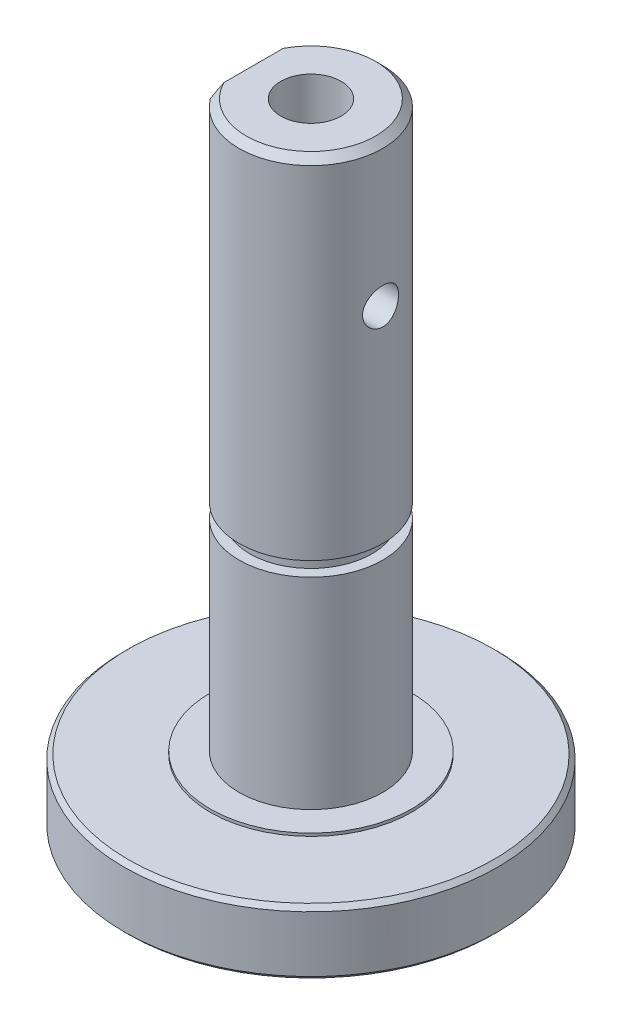
ISO-10303-21;
HEADER;
FILE_DESCRIPTION(('STEP AP214'),'2;1');
FILE_NAME('part.step','',(''),(''),'','','');
FILE_SCHEMA(('AUTOMOTIVE_DESIGN { 1 0 10303 214 1 1 1 1 }'));
ENDSEC;
DATA;
#1=APPLICATION_CONTEXT('core data for automotive mechanical design processes');
#2=APPLICATION_PROTOCOL_DEFINITION('international standard','automotive_design',2000,#1);
#3=PRODUCT_CONTEXT('',#1,'mechanical');
#4=PRODUCT('Part','Part','',(#3));
#5=PRODUCT_RELATED_PRODUCT_CATEGORY('part','',(#4));
#6=PRODUCT_DEFINITION_FORMATION('','',#4);
#7=PRODUCT_DEFINITION_CONTEXT('part definition',#1,'design');
#8=PRODUCT_DEFINITION('design','',#6,#7);
#9=PRODUCT_DEFINITION_SHAPE('','',#8);
#10=(LENGTH_UNIT() NAMED_UNIT(*) SI_UNIT(.MILLI.,.METRE.));
#11=(NAMED_UNIT(*) PLANE_ANGLE_UNIT() SI_UNIT($,.RADIAN.));
#12=(NAMED_UNIT(*) SI_UNIT($,.STERADIAN.) SOLID_ANGLE_UNIT());
#13=UNCERTAINTY_MEASURE_WITH_UNIT(LENGTH_MEASURE(1.E-05),#10,'distance_accuracy_value','');
#14=(GEOMETRIC_REPRESENTATION_CONTEXT(3) GLOBAL_UNCERTAINTY_ASSIGNED_CONTEXT((#13)) GLOBAL_UNIT_ASSIGNED_CONTEXT((#10,
#11,#12)) REPRESENTATION_CONTEXT('',''));
#15=CARTESIAN_POINT('',(0.,0.,0.));
#16=DIRECTION('',(0.,0.,1.));
#17=DIRECTION('',(1.,0.,0.));
#18=AXIS2_PLACEMENT_3D('',#15,#16,#17);
#19=CARTESIAN_POINT('',(0.,0.,0.));
#20=DIRECTION('',(0.,1.,0.));
#21=DIRECTION('',(0.,0.,1.));
#22=AXIS2_PLACEMENT_3D('',#19,#20,#21);
#23=CYLINDRICAL_SURFACE('',#22,13.);
#24=CARTESIAN_POINT('',(0.,4.19999999999998,0.));
#25=DIRECTION('',(0.,1.,0.));
#26=DIRECTION('',(0.,0.,1.));
#27=AXIS2_PLACEMENT_3D('',#24,#25,#26);
#28=CIRCLE('',#27,13.);
#29=CARTESIAN_POINT('',(0.,4.19999999999998,13.));
#30=VERTEX_POINT('',#29);
#31=EDGE_CURVE('E186',#30,#30,#28,.F.);
#32=ORIENTED_EDGE('',*,*,#31,.T.);
#33=EDGE_LOOP('',(#32));
#34=FACE_BOUND('',#33,.T.);
#35=CARTESIAN_POINT('',(0.,0.300000000000004,0.));
#36=DIRECTION('',(0.,-1.,0.));
#37=DIRECTION('',(0.,0.,-1.));
#38=AXIS2_PLACEMENT_3D('',#35,#36,#37);
#39=CIRCLE('',#38,13.);
#40=CARTESIAN_POINT('',(0.,0.300000000000004,-13.));
#41=VERTEX_POINT('',#40);
#42=EDGE_CURVE('E184',#41,#41,#39,.F.);
#43=ORIENTED_EDGE('',*,*,#42,.T.);
#44=EDGE_LOOP('',(#43));
#45=FACE_BOUND('',#44,.T.);
#46=ADVANCED_FACE('F36',(#34,#45),#23,.T.);
#47=CARTESIAN_POINT('',(13.,0.,0.));
#48=DIRECTION('',(0.,-1.,0.));
#49=DIRECTION('',(0.,0.,-1.));
#50=AXIS2_PLACEMENT_3D('',#47,#48,#49);
#51=PLANE('',#50);
#52=CARTESIAN_POINT('',(0.,0.,0.));
#53=DIRECTION('',(0.,-1.,0.));
#54=DIRECTION('',(0.,0.,-1.));
#55=AXIS2_PLACEMENT_3D('',#52,#53,#54);
#56=CIRCLE('',#55,12.7);
#57=CARTESIAN_POINT('',(0.,0.,-12.7));
#58=VERTEX_POINT('',#57);
#59=EDGE_CURVE('E181',#58,#58,#56,.T.);
#60=ORIENTED_EDGE('',*,*,#59,.T.);
#61=EDGE_LOOP('',(#60));
#62=FACE_BOUND('',#61,.T.);
#63=ADVANCED_FACE('F161',(#62),#51,.T.);
#64=CARTESIAN_POINT('',(0.,44.,0.));
#65=DIRECTION('',(0.,1.,0.));
#66=DIRECTION('',(0.,0.,1.));
#67=AXIS2_PLACEMENT_3D('',#64,#65,#66);
#68=PLANE('',#67);
#69=CARTESIAN_POINT('',(0.,44.,0.));
#70=DIRECTION('',(0.,1.,0.));
#71=DIRECTION('',(0.,0.,1.));
#72=AXIS2_PLACEMENT_3D('',#69,#70,#71);
#73=CIRCLE('',#72,2.09999999999999);
#74=CARTESIAN_POINT('',(0.,44.,2.09999999999998));
#75=VERTEX_POINT('',#74);
#76=EDGE_CURVE('E83',#75,#75,#73,.T.);
#77=ORIENTED_EDGE('',*,*,#76,.F.);
#78=EDGE_LOOP('',(#77));
#79=FACE_BOUND('',#78,.T.);
#80=DIRECTION('',(0.,0.,-1.));
#81=VECTOR('',#80,1.);
#82=CARTESIAN_POINT('',(-4.,44.,3.));
#83=LINE('',#82,#81);
#84=CARTESIAN_POINT('',(-4.,44.,2.06155281280882));
#85=VERTEX_POINT('',#84);
#86=CARTESIAN_POINT('',(-4.,44.,-2.06155281280882));
#87=VERTEX_POINT('',#86);
#88=EDGE_CURVE('E82',#85,#87,#83,.T.);
#89=ORIENTED_EDGE('',*,*,#88,.F.);
#90=CARTESIAN_POINT('',(0.,44.,0.));
#91=DIRECTION('',(0.,1.,0.));
#92=DIRECTION('',(0.,0.,1.));
#93=AXIS2_PLACEMENT_3D('',#90,#91,#92);
#94=CIRCLE('',#93,4.5);
#95=EDGE_CURVE('E193',#85,#87,#94,.T.);
#96=ORIENTED_EDGE('',*,*,#95,.T.);
#97=EDGE_LOOP('',(#89,#96));
#98=FACE_BOUND('',#97,.T.);
#99=ADVANCED_FACE('F156',(#79,#98),#68,.T.);
#100=CARTESIAN_POINT('',(0.,0.,0.));
#101=DIRECTION('',(0.,1.,0.));
#102=DIRECTION('',(0.,0.,1.));
#103=AXIS2_PLACEMENT_3D('',#100,#101,#102);
#104=CYLINDRICAL_SURFACE('',#103,5.);
#105=CARTESIAN_POINT('',(4.84122918275928,34.,1.24999999999997));
#106=CARTESIAN_POINT('',(4.84123050042655,33.9309746245377,1.24999803929586));
#107=CARTESIAN_POINT('',(4.84272153006957,33.861927550661,1.24426312274862));
#108=CARTESIAN_POINT('',(4.84850930996625,33.725816210913,1.22151156273204));
#109=CARTESIAN_POINT('',(4.85280769310907,33.6587531227658,1.20448835337107));
#110=CARTESIAN_POINT('',(4.86369362297984,33.5285982309065,1.15974559981594));
#111=CARTESIAN_POINT('',(4.87027821345205,33.4655014223072,1.1320398639272));
#112=CARTESIAN_POINT('',(4.88499096014404,33.3448445737301,1.06676057063068));
#113=CARTESIAN_POINT('',(4.89311918189252,33.2872847689599,1.02918659428032));
#114=CARTESIAN_POINT('',(4.91020358177806,33.1780691773689,0.944354213655909));
#115=CARTESIAN_POINT('',(4.91917298811516,33.126553199825,0.896918443851998));
#116=CARTESIAN_POINT('',(4.93681437757649,33.0321193028199,0.794091032050308));
#117=CARTESIAN_POINT('',(4.94548633283195,32.9892021871892,0.73869864709013));
#118=CARTESIAN_POINT('',(4.96170207760291,32.9126122661844,0.620572600539457));
#119=CARTESIAN_POINT('',(4.96922843700296,32.8790768059193,0.557747288097542));
#120=CARTESIAN_POINT('',(4.98215405962992,32.8230951779235,0.427131592146366));
#121=CARTESIAN_POINT('',(4.98755363667172,32.8006473740423,0.359341942895956));
#122=CARTESIAN_POINT('',(4.9955237942409,32.7679260827107,0.222179379377068));
#123=CARTESIAN_POINT('',(4.99814946922157,32.7574151778367,0.152866359774477));
#124=CARTESIAN_POINT('',(5.00046797053649,32.7481208103622,0.0134144096313771));
#125=CARTESIAN_POINT('',(5.00016123048352,32.7493356138952,-0.056724397269041));
#126=CARTESIAN_POINT('',(4.99669047476767,32.7632874251251,-0.194190308965488));
#127=CARTESIAN_POINT('',(4.99359001170437,32.775768162527,-0.261545269501336));
#128=CARTESIAN_POINT('',(4.98495418262427,32.8114856350243,-0.393172809267107));
#129=CARTESIAN_POINT('',(4.9794186869922,32.8347229426887,-0.457445224213046));
#130=CARTESIAN_POINT('',(4.96643754850448,32.8915012853436,-0.581758379377254));
#131=CARTESIAN_POINT('',(4.95897509847527,32.9251335223309,-0.641755637208126));
#132=CARTESIAN_POINT('',(4.94294951904825,33.0016778395582,-0.755344527925603));
#133=CARTESIAN_POINT('',(4.93438619826245,33.0445915342803,-0.808935043856872));
#134=CARTESIAN_POINT('',(4.9168185688476,33.1398543709912,-0.909717543856183));
#135=CARTESIAN_POINT('',(4.90780859762959,33.1924274461739,-0.956697098843987));
#136=CARTESIAN_POINT('',(4.89057521758353,33.3047999867701,-1.04122046995376));
#137=CARTESIAN_POINT('',(4.88235184552986,33.3645997897455,-1.0787638450575));
#138=CARTESIAN_POINT('',(4.86760248415824,33.4901450170745,-1.14348516127823));
#139=CARTESIAN_POINT('',(4.86108491862861,33.5559178651566,-1.1706119587131));
#140=CARTESIAN_POINT('',(4.85059320069979,33.6912927340382,-1.21335702579541));
#141=CARTESIAN_POINT('',(4.8466185040511,33.7608939319916,-1.22897775819112));
#142=CARTESIAN_POINT('',(4.84177678019571,33.8999797507616,-1.24791481933257));
#143=CARTESIAN_POINT('',(4.84083044546825,33.9694188966648,-1.25154523695979));
#144=CARTESIAN_POINT('',(4.8419367174052,34.1079109682891,-1.24725849525775));
#145=CARTESIAN_POINT('',(4.84398904800634,34.1769639289756,-1.23934239892438));
#146=CARTESIAN_POINT('',(4.85078540977281,34.3115571324774,-1.21246273196881));
#147=CARTESIAN_POINT('',(4.85548485117188,34.3771363632854,-1.19368203414085));
#148=CARTESIAN_POINT('',(4.86700359135482,34.5042157289258,-1.14580904083529));
#149=CARTESIAN_POINT('',(4.87382314124307,34.5657153795277,-1.11671552385625));
#150=CARTESIAN_POINT('',(4.88898068546632,34.6842206389337,-1.04838533396826));
#151=CARTESIAN_POINT('',(4.89734584303321,34.7411144200215,-1.00896087691779));
#152=CARTESIAN_POINT('',(4.91458541535858,34.8475941814007,-0.921325366168048));
#153=CARTESIAN_POINT('',(4.92345991364235,34.897178958325,-0.873112868506778));
#154=CARTESIAN_POINT('',(4.94098701515803,34.9889055212855,-0.767828401230889));
#155=CARTESIAN_POINT('',(4.94962851030918,35.0308300312744,-0.710564940664475));
#156=CARTESIAN_POINT('',(4.96548608306867,35.1044679334756,-0.589628353368331));
#157=CARTESIAN_POINT('',(4.9727022350198,35.1361818583041,-0.525955561196977));
#158=CARTESIAN_POINT('',(4.98485057869157,35.1882230172639,-0.394447752163853));
#159=CARTESIAN_POINT('',(4.98979915011205,35.2086321421895,-0.326646726284843));
#160=CARTESIAN_POINT('',(4.99692646697894,35.2377301673042,-0.188437200398504));
#161=CARTESIAN_POINT('',(4.99910574696704,35.2464213293695,-0.11802920630155));
#162=CARTESIAN_POINT('',(5.00042711761014,35.2517094869694,0.0213544080541597));
#163=CARTESIAN_POINT('',(4.9996497360001,35.2486271363692,0.0903172837075422));
#164=CARTESIAN_POINT('',(4.99532370571779,35.2311902158821,0.226709370518423));
#165=CARTESIAN_POINT('',(4.99177513946369,35.2168359812336,0.294138627226105));
#166=CARTESIAN_POINT('',(4.98231791067453,35.1774347252863,0.425213794556013));
#167=CARTESIAN_POINT('',(4.97642205628333,35.1524456833567,0.488878118226264));
#168=CARTESIAN_POINT('',(4.9628911114173,35.0925367762258,0.611146316301824));
#169=CARTESIAN_POINT('',(4.9552558017217,35.057615659163,0.669749551581303));
#170=CARTESIAN_POINT('',(4.93884062101666,34.9778559575036,0.78175241052986));
#171=CARTESIAN_POINT('',(4.93003771182014,34.9327998213658,0.834993735375713));
#172=CARTESIAN_POINT('',(4.91238311316553,34.8344714350327,0.933268775339048));
#173=CARTESIAN_POINT('',(4.90353141190695,34.7811971048776,0.978300406335215));
#174=CARTESIAN_POINT('',(4.88659344825686,34.6667482322483,1.05970253309901));
#175=CARTESIAN_POINT('',(4.87852454662356,34.6054448457342,1.09589577430816));
#176=CARTESIAN_POINT('',(4.8642994443827,34.4774306375966,1.15740862076955));
#177=CARTESIAN_POINT('',(4.85814185308379,34.4107237923666,1.18273613719962));
#178=CARTESIAN_POINT('',(4.8493988592473,34.2867787352166,1.21802816070677));
#179=CARTESIAN_POINT('',(4.84635828750684,34.2301335445202,1.22999146324419));
#180=CARTESIAN_POINT('',(4.84227298231966,34.11566391375,1.24597786571656));
#181=CARTESIAN_POINT('',(4.84122807862455,34.0578395746937,1.2500016429652));
#182=CARTESIAN_POINT('',(4.84122918275928,34.,1.24999999999997));
#183=B_SPLINE_CURVE_WITH_KNOTS('',3,(#105,#106,#107,#108,#109,#110,#111,#112,#113,#114,#115,
#116,#117,#118,#119,#120,#121,#122,#123,#124,#125,#126,#127,#128,#129,#130,#131,#132,#133,#134,
#135,#136,#137,#138,#139,#140,#141,#142,#143,#144,#145,#146,#147,#148,#149,#150,#151,#152,#153,
#154,#155,#156,#157,#158,#159,#160,#161,#162,#163,#164,#165,#166,#167,#168,#169,#170,#171,#172,
#173,#174,#175,#176,#177,#178,#179,#180,#181,#182),.UNSPECIFIED.,.T.,.F.,(4,2,2,2,2,2,2,2,2,2,2,
2,2,2,2,2,2,2,2,2,2,2,2,2,2,2,2,2,2,2,2,2,2,2,2,2,2,2,4),(0.,0.206863720868061,
0.413847870714328,0.620565363583003,0.827291633777379,1.03811977096487,1.24896760739931,
1.46275748198957,1.67651579923543,1.88594375497669,2.09534074333006,2.30009131344469,
2.50485278362388,2.71146437127217,2.91811192734451,3.13035233285949,3.34260265599894,
3.55588216004194,3.76911600064766,3.9767178738085,4.18430063591893,4.38848702504595,
4.59269760710699,4.80091422929569,5.00916509442512,5.22262665482649,5.43607707859765,
5.64796036403453,5.85980274454507,6.06591723063716,6.27202558688478,6.47702438279842,
6.68204902869023,6.89198548291021,7.1019751578274,7.31588238642324,7.52963360683294,
7.70298913588649,7.87632987549744),.UNSPECIFIED.);
#184=CARTESIAN_POINT('',(4.84122918275928,34.,1.24999999999997));
#185=VERTEX_POINT('',#184);
#186=EDGE_CURVE('E88',#185,#185,#183,.T.);
#187=ORIENTED_EDGE('',*,*,#186,.F.);
#188=EDGE_LOOP('',(#187));
#189=FACE_BOUND('',#188,.T.);
#190=DIRECTION('',(0.,1.,0.));
#191=VECTOR('',#190,1.);
#192=CARTESIAN_POINT('',(-4.,24.,-3.00000000000001));
#193=LINE('',#192,#191);
#194=CARTESIAN_POINT('',(-4.,24.,-3.));
#195=VERTEX_POINT('',#194);
#196=CARTESIAN_POINT('',(-4.,43.5,-3.00000000000001));
#197=VERTEX_POINT('',#196);
#198=EDGE_CURVE('E96',#195,#197,#193,.T.);
#199=ORIENTED_EDGE('',*,*,#198,.T.);
#200=CARTESIAN_POINT('',(0.,43.5,0.));
#201=DIRECTION('',(0.,1.,0.));
#202=DIRECTION('',(0.,0.,1.));
#203=AXIS2_PLACEMENT_3D('',#200,#201,#202);
#204=CIRCLE('',#203,5.);
#205=CARTESIAN_POINT('',(-4.,43.5,3.));
#206=VERTEX_POINT('',#205);
#207=EDGE_CURVE('E11',#197,#206,#204,.F.);
#208=ORIENTED_EDGE('',*,*,#207,.T.);
#209=DIRECTION('',(0.,1.,0.));
#210=VECTOR('',#209,1.);
#211=CARTESIAN_POINT('',(-4.,24.,3.));
#212=LINE('',#211,#210);
#213=CARTESIAN_POINT('',(-4.,24.,3.));
#214=VERTEX_POINT('',#213);
#215=EDGE_CURVE('E94',#214,#206,#212,.T.);
#216=ORIENTED_EDGE('',*,*,#215,.F.);
#217=CARTESIAN_POINT('',(0.,24.,0.));
#218=DIRECTION('',(0.,1.,0.));
#219=DIRECTION('',(0.,0.,1.));
#220=AXIS2_PLACEMENT_3D('',#217,#218,#219);
#221=CIRCLE('',#220,5.);
#222=EDGE_CURVE('E85',#195,#214,#221,.T.);
#223=ORIENTED_EDGE('',*,*,#222,.F.);
#224=EDGE_LOOP('',(#199,#208,#216,#223));
#225=FACE_BOUND('',#224,.T.);
#226=CARTESIAN_POINT('',(0.,19.7,0.));
#227=DIRECTION('',(0.,1.,0.));
#228=DIRECTION('',(0.,0.,1.));
#229=AXIS2_PLACEMENT_3D('',#226,#227,#228);
#230=CIRCLE('',#229,5.);
#231=CARTESIAN_POINT('',(0.,19.7,5.));
#232=VERTEX_POINT('',#231);
#233=EDGE_CURVE('E117',#232,#232,#230,.T.);
#234=ORIENTED_EDGE('',*,*,#233,.T.);
#235=EDGE_LOOP('',(#234));
#236=FACE_BOUND('',#235,.T.);
#237=ADVANCED_FACE('F150',(#189,#225,#236),#104,.T.);
#238=CARTESIAN_POINT('',(5.,19.7,0.));
#239=DIRECTION('',(0.,-1.,0.));
#240=DIRECTION('',(0.,0.,-1.));
#241=AXIS2_PLACEMENT_3D('',#238,#239,#240);
#242=PLANE('',#241);
#243=CARTESIAN_POINT('',(0.,19.7,0.));
#244=DIRECTION('',(0.,1.,0.));
#245=DIRECTION('',(0.,0.,1.));
#246=AXIS2_PLACEMENT_3D('',#243,#244,#245);
#247=CIRCLE('',#246,4.25);
#248=CARTESIAN_POINT('',(0.,19.7,4.25));
#249=VERTEX_POINT('',#248);
#250=EDGE_CURVE('E114',#249,#249,#247,.T.);
#251=ORIENTED_EDGE('',*,*,#250,.T.);
#252=EDGE_LOOP('',(#251));
#253=FACE_BOUND('',#252,.T.);
#254=ORIENTED_EDGE('',*,*,#233,.F.);
#255=EDGE_LOOP('',(#254));
#256=FACE_BOUND('',#255,.T.);
#257=ADVANCED_FACE('F155',(#253,#256),#242,.T.);
#258=CARTESIAN_POINT('',(0.,0.,0.));
#259=DIRECTION('',(0.,1.,0.));
#260=DIRECTION('',(0.,0.,1.));
#261=AXIS2_PLACEMENT_3D('',#258,#259,#260);
#262=CYLINDRICAL_SURFACE('',#261,4.25);
#263=CARTESIAN_POINT('',(0.,18.7,0.));
#264=DIRECTION('',(0.,1.,0.));
#265=DIRECTION('',(0.,0.,1.));
#266=AXIS2_PLACEMENT_3D('',#263,#264,#265);
#267=CIRCLE('',#266,4.25);
#268=CARTESIAN_POINT('',(0.,18.7,4.25));
#269=VERTEX_POINT('',#268);
#270=EDGE_CURVE('E111',#269,#269,#267,.T.);
#271=ORIENTED_EDGE('',*,*,#270,.T.);
#272=EDGE_LOOP('',(#271));
#273=FACE_BOUND('',#272,.T.);
#274=ORIENTED_EDGE('',*,*,#250,.F.);
#275=EDGE_LOOP('',(#274));
#276=FACE_BOUND('',#275,.T.);
#277=ADVANCED_FACE('F231',(#273,#276),#262,.T.);
#278=CARTESIAN_POINT('',(4.25,18.7,0.));
#279=DIRECTION('',(0.,1.,0.));
#280=DIRECTION('',(0.,0.,1.));
#281=AXIS2_PLACEMENT_3D('',#278,#279,#280);
#282=PLANE('',#281);
#283=CARTESIAN_POINT('',(0.,18.7,0.));
#284=DIRECTION('',(0.,1.,0.));
#285=DIRECTION('',(0.,0.,1.));
#286=AXIS2_PLACEMENT_3D('',#283,#284,#285);
#287=CIRCLE('',#286,5.);
#288=CARTESIAN_POINT('',(0.,18.7,5.));
#289=VERTEX_POINT('',#288);
#290=EDGE_CURVE('E108',#289,#289,#287,.T.);
#291=ORIENTED_EDGE('',*,*,#290,.T.);
#292=EDGE_LOOP('',(#291));
#293=FACE_BOUND('',#292,.T.);
#294=ORIENTED_EDGE('',*,*,#270,.F.);
#295=EDGE_LOOP('',(#294));
#296=FACE_BOUND('',#295,.T.);
#297=ADVANCED_FACE('F228',(#293,#296),#282,.T.);
#298=CARTESIAN_POINT('',(0.,0.,0.));
#299=DIRECTION('',(0.,1.,0.));
#300=DIRECTION('',(0.,0.,1.));
#301=AXIS2_PLACEMENT_3D('',#298,#299,#300);
#302=CYLINDRICAL_SURFACE('',#301,5.);
#303=CARTESIAN_POINT('',(0.,4.7,0.));
#304=DIRECTION('',(0.,1.,0.));
#305=DIRECTION('',(0.,0.,1.));
#306=AXIS2_PLACEMENT_3D('',#303,#304,#305);
#307=CIRCLE('',#306,5.);
#308=CARTESIAN_POINT('',(0.,4.7,5.));
#309=VERTEX_POINT('',#308);
#310=EDGE_CURVE('E105',#309,#309,#307,.T.);
#311=ORIENTED_EDGE('',*,*,#310,.T.);
#312=EDGE_LOOP('',(#311));
#313=FACE_BOUND('',#312,.T.);
#314=ORIENTED_EDGE('',*,*,#290,.F.);
#315=EDGE_LOOP('',(#314));
#316=FACE_BOUND('',#315,.T.);
#317=ADVANCED_FACE('F224',(#313,#316),#302,.T.);
#318=CARTESIAN_POINT('',(5.,4.7,0.));
#319=DIRECTION('',(0.,1.,0.));
#320=DIRECTION('',(0.,0.,1.));
#321=AXIS2_PLACEMENT_3D('',#318,#319,#320);
#322=PLANE('',#321);
#323=CARTESIAN_POINT('',(0.,4.7,0.));
#324=DIRECTION('',(0.,1.,0.));
#325=DIRECTION('',(0.,0.,1.));
#326=AXIS2_PLACEMENT_3D('',#323,#324,#325);
#327=CIRCLE('',#326,7.);
#328=CARTESIAN_POINT('',(0.,4.7,7.));
#329=VERTEX_POINT('',#328);
#330=EDGE_CURVE('E102',#329,#329,#327,.T.);
#331=ORIENTED_EDGE('',*,*,#330,.T.);
#332=EDGE_LOOP('',(#331));
#333=FACE_BOUND('',#332,.T.);
#334=ORIENTED_EDGE('',*,*,#310,.F.);
#335=EDGE_LOOP('',(#334));
#336=FACE_BOUND('',#335,.T.);
#337=ADVANCED_FACE('F220',(#333,#336),#322,.T.);
#338=CARTESIAN_POINT('',(0.,0.,0.));
#339=DIRECTION('',(0.,1.,0.));
#340=DIRECTION('',(0.,0.,1.));
#341=AXIS2_PLACEMENT_3D('',#338,#339,#340);
#342=CYLINDRICAL_SURFACE('',#341,7.);
#343=CARTESIAN_POINT('',(0.,4.5,0.));
#344=DIRECTION('',(0.,1.,0.));
#345=DIRECTION('',(0.,0.,1.));
#346=AXIS2_PLACEMENT_3D('',#343,#344,#345);
#347=CIRCLE('',#346,7.);
#348=CARTESIAN_POINT('',(0.,4.5,7.));
#349=VERTEX_POINT('',#348);
#350=EDGE_CURVE('E98',#349,#349,#347,.T.);
#351=ORIENTED_EDGE('',*,*,#350,.T.);
#352=EDGE_LOOP('',(#351));
#353=FACE_BOUND('',#352,.T.);
#354=ORIENTED_EDGE('',*,*,#330,.F.);
#355=EDGE_LOOP('',(#354));
#356=FACE_BOUND('',#355,.T.);
#357=ADVANCED_FACE('F216',(#353,#356),#342,.T.);
#358=CARTESIAN_POINT('',(7.,4.5,0.));
#359=DIRECTION('',(0.,1.,0.));
#360=DIRECTION('',(0.,0.,1.));
#361=AXIS2_PLACEMENT_3D('',#358,#359,#360);
#362=PLANE('',#361);
#363=CARTESIAN_POINT('',(0.,4.5,0.));
#364=DIRECTION('',(0.,1.,0.));
#365=DIRECTION('',(0.,0.,1.));
#366=AXIS2_PLACEMENT_3D('',#363,#364,#365);
#367=CIRCLE('',#366,12.7);
#368=CARTESIAN_POINT('',(0.,4.5,12.7));
#369=VERTEX_POINT('',#368);
#370=EDGE_CURVE('E120',#369,#369,#367,.T.);
#371=ORIENTED_EDGE('',*,*,#370,.T.);
#372=EDGE_LOOP('',(#371));
#373=FACE_BOUND('',#372,.T.);
#374=ORIENTED_EDGE('',*,*,#350,.F.);
#375=EDGE_LOOP('',(#374));
#376=FACE_BOUND('',#375,.T.);
#377=ADVANCED_FACE('F211',(#373,#376),#362,.T.);
#378=CARTESIAN_POINT('',(-4.,24.,3.));
#379=DIRECTION('',(1.,0.,0.));
#380=DIRECTION('',(0.,0.,-1.));
#381=AXIS2_PLACEMENT_3D('',#378,#379,#380);
#382=PLANE('',#381);
#383=CARTESIAN_POINT('',(-4.,34.,0.));
#384=DIRECTION('',(-1.,0.,0.));
#385=DIRECTION('',(0.,0.,1.));
#386=AXIS2_PLACEMENT_3D('',#383,#384,#385);
#387=CIRCLE('',#386,1.24999999999997);
#388=CARTESIAN_POINT('',(-4.,34.,1.24999999999997));
#389=VERTEX_POINT('',#388);
#390=EDGE_CURVE('E130',#389,#389,#387,.T.);
#391=ORIENTED_EDGE('',*,*,#390,.F.);
#392=EDGE_LOOP('',(#391));
#393=FACE_BOUND('',#392,.T.);
#394=ORIENTED_EDGE('',*,*,#88,.T.);
#395=CARTESIAN_POINT('',(-4.,44.,-2.06155281280882));
#396=CARTESIAN_POINT('',(-4.,43.9630496979743,-2.14219323284077));
#397=CARTESIAN_POINT('',(-4.,43.9247002515541,-2.22218014248439));
#398=CARTESIAN_POINT('',(-4.,43.8455639268503,-2.38086486210243));
#399=CARTESIAN_POINT('',(-4.,43.8047789265234,-2.45956360716282));
#400=CARTESIAN_POINT('',(-4.,43.7210803938128,-2.61580254891195));
#401=CARTESIAN_POINT('',(-4.,43.6781671323901,-2.6933428914561));
#402=CARTESIAN_POINT('',(-4.,43.5904380705829,-2.84741921077896));
#403=CARTESIAN_POINT('',(-4.,43.5456208464753,-2.92395437787625));
#404=CARTESIAN_POINT('',(-4.,43.5,-3.));
#405=B_SPLINE_CURVE_WITH_KNOTS('',3,(#395,#396,#397,#398,#399,#400,#401,#402,#403,#404),
.UNSPECIFIED.,.F.,.F.,(4,2,2,2,4),(0.,0.266079035280999,0.53195549250538,0.797798185964648,
1.06384329320022),.UNSPECIFIED.);
#406=EDGE_CURVE('E45',#87,#197,#405,.T.);
#407=ORIENTED_EDGE('',*,*,#406,.T.);
#408=ORIENTED_EDGE('',*,*,#198,.F.);
#409=DIRECTION('',(0.,0.,-1.));
#410=VECTOR('',#409,1.);
#411=CARTESIAN_POINT('',(-4.,24.,3.));
#412=LINE('',#411,#410);
#413=EDGE_CURVE('E93',#214,#195,#412,.T.);
#414=ORIENTED_EDGE('',*,*,#413,.F.);
#415=ORIENTED_EDGE('',*,*,#215,.T.);
#416=CARTESIAN_POINT('',(-4.,43.5,3.));
#417=CARTESIAN_POINT('',(-4.,43.5456208464753,2.92395437787624));
#418=CARTESIAN_POINT('',(-4.,43.5904380705829,2.84741921077895));
#419=CARTESIAN_POINT('',(-4.,43.6781671323901,2.69334289145609));
#420=CARTESIAN_POINT('',(-4.,43.7210803938128,2.61580254891194));
#421=CARTESIAN_POINT('',(-4.,43.8047789265234,2.45956360716282));
#422=CARTESIAN_POINT('',(-4.,43.8455639268503,2.38086486210243));
#423=CARTESIAN_POINT('',(-4.,43.9247002515541,2.22218014248439));
#424=CARTESIAN_POINT('',(-4.,43.9630496979743,2.14219323284077));
#425=CARTESIAN_POINT('',(-4.,44.,2.06155281280882));
#426=B_SPLINE_CURVE_WITH_KNOTS('',3,(#416,#417,#418,#419,#420,#421,#422,#423,#424,#425),
.UNSPECIFIED.,.F.,.F.,(4,2,2,2,4),(0.,0.266045107235572,0.531887800694837,0.79776425791922,
1.06384329320021),.UNSPECIFIED.);
#427=EDGE_CURVE('E196',#206,#85,#426,.T.);
#428=ORIENTED_EDGE('',*,*,#427,.T.);
#429=EDGE_LOOP('',(#394,#407,#408,#414,#415,#428));
#430=FACE_BOUND('',#429,.T.);
#431=ADVANCED_FACE('F206',(#393,#430),#382,.F.);
#432=CARTESIAN_POINT('',(0.,24.,0.));
#433=DIRECTION('',(0.,1.,0.));
#434=DIRECTION('',(0.,0.,1.));
#435=AXIS2_PLACEMENT_3D('',#432,#433,#434);
#436=PLANE('',#435);
#437=ORIENTED_EDGE('',*,*,#222,.T.);
#438=ORIENTED_EDGE('',*,*,#413,.T.);
#439=EDGE_LOOP('',(#437,#438));
#440=FACE_BOUND('',#439,.T.);
#441=ADVANCED_FACE('F76',(#440),#436,.T.);
#442=CARTESIAN_POINT('',(0.,30.,0.));
#443=DIRECTION('',(0.,1.,0.));
#444=DIRECTION('',(0.,0.,1.));
#445=AXIS2_PLACEMENT_3D('',#442,#443,#444);
#446=CONICAL_SURFACE('',#445,2.09999999999999,1.02974425867665);
#447=CARTESIAN_POINT('',(0.,28.7381927000421,0.));
#448=VERTEX_POINT('',#447);
#449=VERTEX_LOOP('',#448);
#450=FACE_BOUND('',#449,.T.);
#451=CARTESIAN_POINT('',(0.,30.,0.));
#452=DIRECTION('',(0.,1.,0.));
#453=DIRECTION('',(0.,0.,1.));
#454=AXIS2_PLACEMENT_3D('',#451,#452,#453);
#455=CIRCLE('',#454,2.09999999999999);
#456=CARTESIAN_POINT('',(0.,30.,2.09999999999998));
#457=VERTEX_POINT('',#456);
#458=EDGE_CURVE('E80',#457,#457,#455,.T.);
#459=ORIENTED_EDGE('',*,*,#458,.T.);
#460=EDGE_LOOP('',(#459));
#461=FACE_BOUND('',#460,.T.);
#462=ADVANCED_FACE('F72',(#450,#461),#446,.F.);
#463=CARTESIAN_POINT('',(0.,44.,0.));
#464=DIRECTION('',(0.,1.,0.));
#465=DIRECTION('',(0.,0.,1.));
#466=AXIS2_PLACEMENT_3D('',#463,#464,#465);
#467=CYLINDRICAL_SURFACE('',#466,2.09999999999999);
#468=CARTESIAN_POINT('',(1.68745370306862,34.,1.24999999999997));
#469=CARTESIAN_POINT('',(1.68745034276093,33.9369807688424,1.25000239170534));
#470=CARTESIAN_POINT('',(1.69103664835489,33.8739734563313,1.24520529451587));
#471=CARTESIAN_POINT('',(1.70474679595877,33.7500674709261,1.22636400209899));
#472=CARTESIAN_POINT('',(1.71487738194761,33.6891710416161,1.21231026747483));
#473=CARTESIAN_POINT('',(1.74005212591714,33.5715469560148,1.1758819813913));
#474=CARTESIAN_POINT('',(1.75506137659342,33.5147930918069,1.15356639107473));
#475=CARTESIAN_POINT('',(1.78823768182833,33.4058699773252,1.10143511508197));
#476=CARTESIAN_POINT('',(1.80640570616565,33.3537021424408,1.07161712482466));
#477=CARTESIAN_POINT('',(1.84649110482345,33.2485546309097,1.00115043304531));
#478=CARTESIAN_POINT('',(1.86859670954315,33.1962301266846,0.959630993855075));
#479=CARTESIAN_POINT('',(1.91255543772762,33.0987444913673,0.868725768563918));
#480=CARTESIAN_POINT('',(1.9344083641813,33.0535886407991,0.819334236951238));
#481=CARTESIAN_POINT('',(1.97814131824753,32.9670025461413,0.70775126566868));
#482=CARTESIAN_POINT('',(1.99977999560898,32.9264707846945,0.64475866964403));
#483=CARTESIAN_POINT('',(2.03797831640918,32.8568893742926,0.511315653757187));
#484=CARTESIAN_POINT('',(2.0545425368969,32.8278293711929,0.440872032182744));
#485=CARTESIAN_POINT('',(2.0793259442839,32.7849396151269,0.301543066903666));
#486=CARTESIAN_POINT('',(2.08818462949668,32.7699323290092,0.233136879738535));
#487=CARTESIAN_POINT('',(2.09903519500876,32.7515984152778,0.0942622194112476));
#488=CARTESIAN_POINT('',(2.10103339220747,32.7482610423604,0.0237957036670198));
#489=CARTESIAN_POINT('',(2.09813230682544,32.7531405925709,-0.107922091393414));
#490=CARTESIAN_POINT('',(2.09404538379902,32.7599965460054,-0.169248048248893));
#491=CARTESIAN_POINT('',(2.08080479776089,32.7824896618899,-0.289691993214681));
#492=CARTESIAN_POINT('',(2.07165075997659,32.7981274738627,-0.348809817662401));
#493=CARTESIAN_POINT('',(2.04899680484597,32.8376101988704,-0.463756390686283));
#494=CARTESIAN_POINT('',(2.03546961141651,32.8615066889577,-0.51956182317357));
#495=CARTESIAN_POINT('',(2.00515802585831,32.9166310960405,-0.626443543108454));
#496=CARTESIAN_POINT('',(1.98837276841127,32.9478609611909,-0.677518568859069));
#497=CARTESIAN_POINT('',(1.95063185016376,33.0209398416211,-0.779972276402226));
#498=CARTESIAN_POINT('',(1.92941771348557,33.0636084533768,-0.830670595039259));
#499=CARTESIAN_POINT('',(1.88620283074344,33.1562342139898,-0.924618522713991));
#500=CARTESIAN_POINT('',(1.86420106723209,33.2062010674506,-0.967858044033157));
#501=CARTESIAN_POINT('',(1.81898477622687,33.3187092126034,-1.05059846125121));
#502=CARTESIAN_POINT('',(1.79591463396037,33.3820335541674,-1.08912301738903));
#503=CARTESIAN_POINT('',(1.75443308799015,33.5157100942002,-1.15476446111588));
#504=CARTESIAN_POINT('',(1.7360131601126,33.5860490990732,-1.18190228277605));
#505=CARTESIAN_POINT('',(1.71064674722224,33.7141148773204,-1.21821699755714));
#506=CARTESIAN_POINT('',(1.70199591964791,33.7707183918098,-1.23016347646414));
#507=CARTESIAN_POINT('',(1.6903673259053,33.8855834556539,-1.24609814114002));
#508=CARTESIAN_POINT('',(1.68738316760645,33.9438430614841,-1.25009529416869));
#509=CARTESIAN_POINT('',(1.68752691741201,34.0604101634911,-1.24990108934573));
#510=CARTESIAN_POINT('',(1.69066238296346,34.1187176298829,-1.24569960656652));
#511=CARTESIAN_POINT('',(1.70258759488903,34.2336251394189,-1.22934677297276));
#512=CARTESIAN_POINT('',(1.71138175763188,34.2902238127719,-1.21718921265709));
#513=CARTESIAN_POINT('',(1.73347146455646,34.4004380075767,-1.18551473616479));
#514=CARTESIAN_POINT('',(1.74677289397925,34.4540495215069,-1.16598819433114));
#515=CARTESIAN_POINT('',(1.77644476006853,34.5574160675005,-1.12026143452762));
#516=CARTESIAN_POINT('',(1.79281636922901,34.6071696159216,-1.09405866554753));
#517=CARTESIAN_POINT('',(1.83029976738453,34.7107962414195,-1.03033888875088));
#518=CARTESIAN_POINT('',(1.85173649059899,34.7638249586793,-0.991637973400139));
#519=CARTESIAN_POINT('',(1.89488021916018,34.8631774277608,-0.906483003373506));
#520=CARTESIAN_POINT('',(1.91658746008853,34.9094948165077,-0.860021679648016));
#521=CARTESIAN_POINT('',(1.96102224478625,34.9999235681624,-0.75372784836936));
#522=CARTESIAN_POINT('',(1.9835395967639,35.0430399946354,-0.692950483156709));
#523=CARTESIAN_POINT('',(2.02410025456372,35.1182506331719,-0.563561688748335));
#524=CARTESIAN_POINT('',(2.04214664926578,35.1503524608997,-0.494955716285485));
#525=CARTESIAN_POINT('',(2.07051819156575,35.1999697964612,-0.357111097841907));
#526=CARTESIAN_POINT('',(2.08131870797544,35.2183943922962,-0.288301009307298));
#527=CARTESIAN_POINT('',(2.09597346751214,35.2432655982129,-0.147852772792826));
#528=CARTESIAN_POINT('',(2.09983526574943,35.249725236381,-0.0762177876473188));
#529=CARTESIAN_POINT('',(2.10013390576011,35.2502232314404,0.0577119901697124));
#530=CARTESIAN_POINT('',(2.0974740482951,35.2457727425383,0.120005553898402));
#531=CARTESIAN_POINT('',(2.08682788032036,35.2277637196305,0.242785529742179));
#532=CARTESIAN_POINT('',(2.07884146621267,35.214205008476,0.30327190668479));
#533=CARTESIAN_POINT('',(2.05839790557037,35.178857817661,0.420088871922342));
#534=CARTESIAN_POINT('',(2.04599926911537,35.1571768568535,0.47646273095494));
#535=CARTESIAN_POINT('',(2.01771031042446,35.1063901393996,0.584793343285839));
#536=CARTESIAN_POINT('',(2.00181918180765,35.0772826677973,0.636749072634305));
#537=CARTESIAN_POINT('',(1.96582330806446,35.0089091625866,0.740874016461108));
#538=CARTESIAN_POINT('',(1.9454480330379,34.9688814261066,0.792448498803109));
#539=CARTESIAN_POINT('',(1.90347784737555,34.8815861994592,0.888554053336312));
#540=CARTESIAN_POINT('',(1.88188157186533,34.834310502085,0.933077023095564));
#541=CARTESIAN_POINT('',(1.83668242030001,34.7270194370884,1.01943750865134));
#542=CARTESIAN_POINT('',(1.81316045028969,34.6661519972768,1.06026705449077));
#543=CARTESIAN_POINT('',(1.76985422427021,34.5371743019266,1.13108089433829));
#544=CARTESIAN_POINT('',(1.7500672087589,34.4690694522243,1.16107321033151));
#545=CARTESIAN_POINT('',(1.71927958106148,34.3349387909372,1.2061279420776));
#546=CARTESIAN_POINT('',(1.70754734237367,34.2695217165242,1.22247828909726));
#547=CARTESIAN_POINT('',(1.69164340542759,34.1360616350043,1.24440278068199));
#548=CARTESIAN_POINT('',(1.68745733023359,34.0680238740816,1.24999741835843));
#549=CARTESIAN_POINT('',(1.68745370306862,34.,1.24999999999997));
#550=B_SPLINE_CURVE_WITH_KNOTS('',3,(#468,#469,#470,#471,#472,#473,#474,#475,#476,#477,#478,
#479,#480,#481,#482,#483,#484,#485,#486,#487,#488,#489,#490,#491,#492,#493,#494,#495,#496,#497,
#498,#499,#500,#501,#502,#503,#504,#505,#506,#507,#508,#509,#510,#511,#512,#513,#514,#515,#516,
#517,#518,#519,#520,#521,#522,#523,#524,#525,#526,#527,#528,#529,#530,#531,#532,#533,#534,#535,
#536,#537,#538,#539,#540,#541,#542,#543,#544,#545,#546,#547,#548,#549),.UNSPECIFIED.,.T.,.F.,(4,
2,2,2,2,2,2,2,2,2,2,2,2,2,2,2,2,2,2,2,2,2,2,2,2,2,2,2,2,2,2,2,2,2,2,2,2,2,2,2,4),(0.,
0.188772639417391,0.377740122865084,0.565384239535792,0.753086067095703,0.963334171309863,
1.17373643553009,1.40638111617894,1.63881533436259,1.84933729080645,2.05966535387395,
2.2443134362334,2.42897517731072,2.61481165375321,2.80069755472553,3.00859735467031,
3.21677616284575,3.44850612430262,3.67980817246205,3.85453493733667,4.02906448913146,
4.20380971307991,4.37869148381774,4.55380248725216,4.72898050183355,4.93535623614857,
5.14192637463604,5.37424988463863,5.60641243733629,5.82126513335358,6.03588374841844,
6.22249091064386,6.40910170235919,6.59332482551191,6.77759052867898,6.98195306204513,
7.18654873759293,7.41637069568069,7.6460221836783,7.85017547961895,8.05393941037312),.UNSPECIFIED.);
#551=CARTESIAN_POINT('',(1.68745370306862,34.,1.24999999999997));
#552=VERTEX_POINT('',#551);
#553=EDGE_CURVE('E129',#552,#552,#550,.T.);
#554=ORIENTED_EDGE('',*,*,#553,.T.);
#555=EDGE_LOOP('',(#554));
#556=FACE_BOUND('',#555,.T.);
#557=CARTESIAN_POINT('',(-1.68745370306862,34.,1.24999999999997));
#558=CARTESIAN_POINT('',(-1.68745034276093,34.0630192311576,1.25000239170534));
#559=CARTESIAN_POINT('',(-1.69103664835489,34.1260265436687,1.24520529451587));
#560=CARTESIAN_POINT('',(-1.70474679595877,34.2499325290739,1.22636400209899));
#561=CARTESIAN_POINT('',(-1.71487738194761,34.3108289583839,1.21231026747483));
#562=CARTESIAN_POINT('',(-1.74005212591714,34.4284530439853,1.1758819813913));
#563=CARTESIAN_POINT('',(-1.75506137659342,34.4852069081931,1.15356639107473));
#564=CARTESIAN_POINT('',(-1.78823768182833,34.5941300226748,1.10143511508197));
#565=CARTESIAN_POINT('',(-1.80640570616565,34.6462978575592,1.07161712482466));
#566=CARTESIAN_POINT('',(-1.84649110482345,34.7514453690903,1.00115043304531));
#567=CARTESIAN_POINT('',(-1.86859670954315,34.8037698733154,0.959630993855073));
#568=CARTESIAN_POINT('',(-1.91255543772762,34.9012555086327,0.868725768563916));
#569=CARTESIAN_POINT('',(-1.9344083641813,34.9464113592009,0.819334236951236));
#570=CARTESIAN_POINT('',(-1.97814131824753,35.0329974538587,0.707751265668679));
#571=CARTESIAN_POINT('',(-1.99977999560898,35.0735292153055,0.64475866964403));
#572=CARTESIAN_POINT('',(-2.03797831640918,35.1431106257074,0.511315653757187));
#573=CARTESIAN_POINT('',(-2.0545425368969,35.1721706288071,0.440872032182744));
#574=CARTESIAN_POINT('',(-2.0793259442839,35.2150603848731,0.301543066903666));
#575=CARTESIAN_POINT('',(-2.08818462949668,35.2300676709908,0.233136879738535));
#576=CARTESIAN_POINT('',(-2.09903519500876,35.2484015847222,0.0942622194112476));
#577=CARTESIAN_POINT('',(-2.10103339220747,35.2517389576396,0.0237957036670198));
#578=CARTESIAN_POINT('',(-2.09813230682544,35.2468594074291,-0.107922091393414));
#579=CARTESIAN_POINT('',(-2.09404538379902,35.2400034539946,-0.169248048248892));
#580=CARTESIAN_POINT('',(-2.08080479776089,35.2175103381101,-0.289691993214681));
#581=CARTESIAN_POINT('',(-2.07165075997659,35.2018725261373,-0.348809817662402));
#582=CARTESIAN_POINT('',(-2.04899680484597,35.1623898011296,-0.463756390686284));
#583=CARTESIAN_POINT('',(-2.03546961141651,35.1384933110423,-0.519561823173571));
#584=CARTESIAN_POINT('',(-2.00515802585831,35.0833689039595,-0.626443543108455));
#585=CARTESIAN_POINT('',(-1.98837276841127,35.0521390388091,-0.67751856885907));
#586=CARTESIAN_POINT('',(-1.95063185016376,34.9790601583789,-0.779972276402229));
#587=CARTESIAN_POINT('',(-1.92941771348557,34.9363915466232,-0.830670595039263));
#588=CARTESIAN_POINT('',(-1.88620283074344,34.8437657860102,-0.924618522713994));
#589=CARTESIAN_POINT('',(-1.86420106723209,34.7937989325494,-0.967858044033159));
#590=CARTESIAN_POINT('',(-1.81898477622687,34.6812907873966,-1.05059846125121));
#591=CARTESIAN_POINT('',(-1.79591463396037,34.6179664458326,-1.08912301738903));
#592=CARTESIAN_POINT('',(-1.75443308799015,34.4842899057998,-1.15476446111588));
#593=CARTESIAN_POINT('',(-1.7360131601126,34.4139509009268,-1.18190228277605));
#594=CARTESIAN_POINT('',(-1.71064674722224,34.2858851226796,-1.21821699755714));
#595=CARTESIAN_POINT('',(-1.70199591964791,34.2292816081902,-1.23016347646414));
#596=CARTESIAN_POINT('',(-1.6903673259053,34.1144165443461,-1.24609814114002));
#597=CARTESIAN_POINT('',(-1.68738316760645,34.0561569385159,-1.25009529416869));
#598=CARTESIAN_POINT('',(-1.68752691741201,33.9395898365089,-1.24990108934573));
#599=CARTESIAN_POINT('',(-1.69066238296346,33.8812823701171,-1.24569960656652));
#600=CARTESIAN_POINT('',(-1.70258759488903,33.7663748605811,-1.22934677297276));
#601=CARTESIAN_POINT('',(-1.71138175763188,33.7097761872281,-1.21718921265709));
#602=CARTESIAN_POINT('',(-1.73347146455646,33.5995619924233,-1.18551473616479));
#603=CARTESIAN_POINT('',(-1.74677289397925,33.5459504784931,-1.16598819433114));
#604=CARTESIAN_POINT('',(-1.77644476006853,33.4425839324995,-1.12026143452762));
#605=CARTESIAN_POINT('',(-1.79281636922901,33.3928303840784,-1.09405866554753));
#606=CARTESIAN_POINT('',(-1.83029976738453,33.2892037585805,-1.03033888875089));
#607=CARTESIAN_POINT('',(-1.85173649059899,33.2361750413208,-0.991637973400143));
#608=CARTESIAN_POINT('',(-1.89488021916018,33.1368225722392,-0.906483003373511));
#609=CARTESIAN_POINT('',(-1.91658746008853,33.0905051834923,-0.860021679648019));
#610=CARTESIAN_POINT('',(-1.96102224478625,33.0000764318376,-0.75372784836936));
#611=CARTESIAN_POINT('',(-1.9835395967639,32.9569600053646,-0.692950483156709));
#612=CARTESIAN_POINT('',(-2.02410025456372,32.8817493668281,-0.563561688748335));
#613=CARTESIAN_POINT('',(-2.04214664926578,32.8496475391003,-0.494955716285485));
#614=CARTESIAN_POINT('',(-2.07051819156575,32.8000302035389,-0.357111097841907));
#615=CARTESIAN_POINT('',(-2.08131870797544,32.7816056077038,-0.288301009307298));
#616=CARTESIAN_POINT('',(-2.09597346751214,32.7567344017871,-0.147852772792826));
#617=CARTESIAN_POINT('',(-2.09983526574943,32.750274763619,-0.0762177876473189));
#618=CARTESIAN_POINT('',(-2.10013390576011,32.7497767685596,0.0577119901697125));
#619=CARTESIAN_POINT('',(-2.0974740482951,32.7542272574617,0.120005553898402));
#620=CARTESIAN_POINT('',(-2.08682788032036,32.7722362803695,0.242785529742179));
#621=CARTESIAN_POINT('',(-2.07884146621267,32.785794991524,0.30327190668479));
#622=CARTESIAN_POINT('',(-2.05839790557037,32.821142182339,0.42008887192234));
#623=CARTESIAN_POINT('',(-2.04599926911537,32.8428231431465,0.476462730954937));
#624=CARTESIAN_POINT('',(-2.01771031042446,32.8936098606004,0.584793343285837));
#625=CARTESIAN_POINT('',(-2.00181918180765,32.9227173322027,0.636749072634303));
#626=CARTESIAN_POINT('',(-1.96582330806446,32.9910908374134,0.740874016461107));
#627=CARTESIAN_POINT('',(-1.9454480330379,33.0311185738935,0.792448498803109));
#628=CARTESIAN_POINT('',(-1.90347784737555,33.1184138005408,0.888554053336312));
#629=CARTESIAN_POINT('',(-1.88188157186533,33.165689497915,0.933077023095565));
#630=CARTESIAN_POINT('',(-1.83668242030001,33.2729805629117,1.01943750865134));
#631=CARTESIAN_POINT('',(-1.81316045028969,33.3338480027232,1.06026705449077));
#632=CARTESIAN_POINT('',(-1.76985422427021,33.4628256980734,1.13108089433829));
#633=CARTESIAN_POINT('',(-1.7500672087589,33.5309305477757,1.16107321033151));
#634=CARTESIAN_POINT('',(-1.71927958106148,33.6650612090628,1.2061279420776));
#635=CARTESIAN_POINT('',(-1.70754734237367,33.7304782834758,1.22247828909726));
#636=CARTESIAN_POINT('',(-1.69164340542759,33.8639383649957,1.24440278068199));
#637=CARTESIAN_POINT('',(-1.68745733023359,33.9319761259184,1.24999741835843));
#638=CARTESIAN_POINT('',(-1.68745370306862,34.,1.24999999999997));
#639=B_SPLINE_CURVE_WITH_KNOTS('',3,(#557,#558,#559,#560,#561,#562,#563,#564,#565,#566,#567,
#568,#569,#570,#571,#572,#573,#574,#575,#576,#577,#578,#579,#580,#581,#582,#583,#584,#585,#586,
#587,#588,#589,#590,#591,#592,#593,#594,#595,#596,#597,#598,#599,#600,#601,#602,#603,#604,#605,
#606,#607,#608,#609,#610,#611,#612,#613,#614,#615,#616,#617,#618,#619,#620,#621,#622,#623,#624,
#625,#626,#627,#628,#629,#630,#631,#632,#633,#634,#635,#636,#637,#638),.UNSPECIFIED.,.T.,.F.,(4,
2,2,2,2,2,2,2,2,2,2,2,2,2,2,2,2,2,2,2,2,2,2,2,2,2,2,2,2,2,2,2,2,2,2,2,2,2,2,2,4),(0.,
0.188772639417391,0.377740122865084,0.565384239535792,0.753086067095703,0.963334171309871,
1.17373643553009,1.40638111617894,1.63881533436259,1.84933729080646,2.05966535387395,
2.2443134362334,2.42897517731072,2.61481165375321,2.80069755472553,3.00859735467032,
3.21677616284575,3.44850612430262,3.67980817246205,3.85453493733667,4.02906448913146,
4.20380971307991,4.37869148381774,4.55380248725216,4.72898050183355,4.93535623614857,
5.14192637463604,5.37424988463863,5.60641243733629,5.82126513335358,6.03588374841844,
6.22249091064386,6.40910170235919,6.59332482551191,6.77759052867899,6.98195306204513,
7.18654873759293,7.41637069568069,7.64602218367831,7.85017547961897,8.05393941037312),.UNSPECIFIED.);
#640=CARTESIAN_POINT('',(-1.68745370306862,34.,1.24999999999997));
#641=VERTEX_POINT('',#640);
#642=EDGE_CURVE('E121',#641,#641,#639,.T.);
#643=ORIENTED_EDGE('',*,*,#642,.T.);
#644=EDGE_LOOP('',(#643));
#645=FACE_BOUND('',#644,.T.);
#646=ORIENTED_EDGE('',*,*,#458,.F.);
#647=EDGE_LOOP('',(#646));
#648=FACE_BOUND('',#647,.T.);
#649=ORIENTED_EDGE('',*,*,#76,.T.);
#650=EDGE_LOOP('',(#649));
#651=FACE_BOUND('',#650,.T.);
#652=ADVANCED_FACE('F75',(#556,#645,#648,#651),#467,.F.);
#653=CARTESIAN_POINT('',(-4.,34.,0.));
#654=DIRECTION('',(-1.,0.,0.));
#655=DIRECTION('',(0.,0.,1.));
#656=AXIS2_PLACEMENT_3D('',#653,#654,#655);
#657=CYLINDRICAL_SURFACE('',#656,1.24999999999997);
#658=ORIENTED_EDGE('',*,*,#390,.T.);
#659=EDGE_LOOP('',(#658));
#660=FACE_BOUND('',#659,.T.);
#661=ORIENTED_EDGE('',*,*,#642,.F.);
#662=EDGE_LOOP('',(#661));
#663=FACE_BOUND('',#662,.T.);
#664=ADVANCED_FACE('F140',(#660,#663),#657,.F.);
#665=ORIENTED_EDGE('',*,*,#186,.T.);
#666=EDGE_LOOP('',(#665));
#667=FACE_BOUND('',#666,.T.);
#668=ORIENTED_EDGE('',*,*,#553,.F.);
#669=EDGE_LOOP('',(#668));
#670=FACE_BOUND('',#669,.T.);
#671=ADVANCED_FACE('F136',(#667,#670),#657,.F.);
#672=CARTESIAN_POINT('',(0.,4.5,0.));
#673=DIRECTION('',(0.,-1.,0.));
#674=DIRECTION('',(0.,0.,-1.));
#675=AXIS2_PLACEMENT_3D('',#672,#673,#674);
#676=CONICAL_SURFACE('',#675,12.7,0.785398163397443);
#677=ORIENTED_EDGE('',*,*,#31,.F.);
#678=EDGE_LOOP('',(#677));
#679=FACE_BOUND('',#678,.T.);
#680=ORIENTED_EDGE('',*,*,#370,.F.);
#681=EDGE_LOOP('',(#680));
#682=FACE_BOUND('',#681,.T.);
#683=ADVANCED_FACE('F139',(#679,#682),#676,.T.);
#684=CARTESIAN_POINT('',(0.,0.300000000000004,0.));
#685=DIRECTION('',(0.,1.,0.));
#686=DIRECTION('',(0.,0.,1.));
#687=AXIS2_PLACEMENT_3D('',#684,#685,#686);
#688=CONICAL_SURFACE('',#687,13.,0.78539816339746);
#689=ORIENTED_EDGE('',*,*,#59,.F.);
#690=EDGE_LOOP('',(#689));
#691=FACE_BOUND('',#690,.T.);
#692=ORIENTED_EDGE('',*,*,#42,.F.);
#693=EDGE_LOOP('',(#692));
#694=FACE_BOUND('',#693,.T.);
#695=ADVANCED_FACE('F170',(#691,#694),#688,.T.);
#696=CARTESIAN_POINT('',(0.,44.,0.));
#697=DIRECTION('',(0.,-1.,0.));
#698=DIRECTION('',(0.,0.,-1.));
#699=AXIS2_PLACEMENT_3D('',#696,#697,#698);
#700=CONICAL_SURFACE('',#699,4.5,0.785398163397451);
#701=ORIENTED_EDGE('',*,*,#427,.F.);
#702=ORIENTED_EDGE('',*,*,#207,.F.);
#703=ORIENTED_EDGE('',*,*,#406,.F.);
#704=ORIENTED_EDGE('',*,*,#95,.F.);
#705=EDGE_LOOP('',(#701,#702,#703,#704));
#706=FACE_BOUND('',#705,.T.);
#707=ADVANCED_FACE('F38',(#706),#700,.T.);
#708=CLOSED_SHELL('',(#46,#63,#99,#237,#257,#277,#297,#317,#337,#357,#377,#431,#441,#462,#652,
#664,#671,#683,#695,#707));
#709=MANIFOLD_SOLID_BREP('B2',#708);
#710=ADVANCED_BREP_SHAPE_REPRESENTATION('',(#18,#709),#14);
#711=SHAPE_DEFINITION_REPRESENTATION(#9,#710);
ENDSEC;
END-ISO-10303-21;
